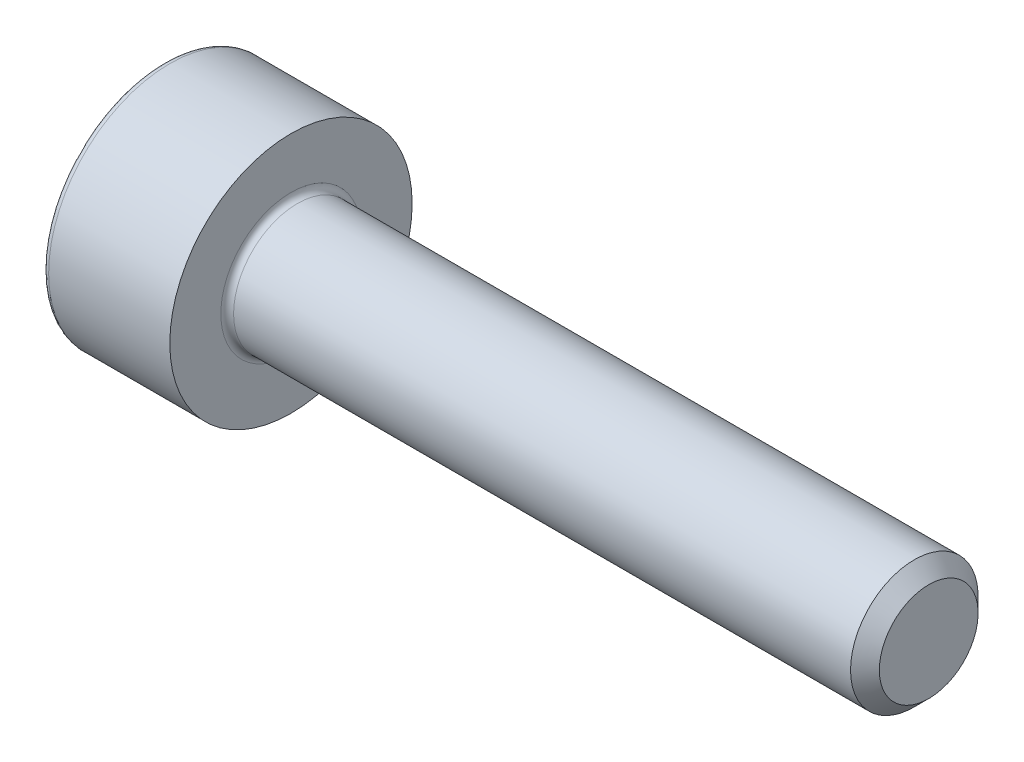
ISO-10303-21;
HEADER;
FILE_DESCRIPTION(('STEP AP214'),'2;1');
FILE_NAME('part.step','',(''),(''),'','','');
FILE_SCHEMA(('AUTOMOTIVE_DESIGN { 1 0 10303 214 1 1 1 1 }'));
ENDSEC;
DATA;
#1=APPLICATION_CONTEXT('core data for automotive mechanical design processes');
#2=APPLICATION_PROTOCOL_DEFINITION('international standard','automotive_design',2000,#1);
#3=PRODUCT_CONTEXT('',#1,'mechanical');
#4=PRODUCT('Part','Part','',(#3));
#5=PRODUCT_RELATED_PRODUCT_CATEGORY('part','',(#4));
#6=PRODUCT_DEFINITION_FORMATION('','',#4);
#7=PRODUCT_DEFINITION_CONTEXT('part definition',#1,'design');
#8=PRODUCT_DEFINITION('design','',#6,#7);
#9=PRODUCT_DEFINITION_SHAPE('','',#8);
#10=(LENGTH_UNIT() NAMED_UNIT(*) SI_UNIT(.MILLI.,.METRE.));
#11=(NAMED_UNIT(*) PLANE_ANGLE_UNIT() SI_UNIT($,.RADIAN.));
#12=(NAMED_UNIT(*) SI_UNIT($,.STERADIAN.) SOLID_ANGLE_UNIT());
#13=UNCERTAINTY_MEASURE_WITH_UNIT(LENGTH_MEASURE(1.E-05),#10,'distance_accuracy_value','');
#14=(GEOMETRIC_REPRESENTATION_CONTEXT(3) GLOBAL_UNCERTAINTY_ASSIGNED_CONTEXT((#13)) GLOBAL_UNIT_ASSIGNED_CONTEXT((#10,
#11,#12)) REPRESENTATION_CONTEXT('',''));
#15=CARTESIAN_POINT('',(0.,0.,0.));
#16=DIRECTION('',(0.,0.,1.));
#17=DIRECTION('',(1.,0.,0.));
#18=AXIS2_PLACEMENT_3D('',#15,#16,#17);
#19=CARTESIAN_POINT('',(0.,0.,0.));
#20=DIRECTION('',(-1.,0.,0.));
#21=DIRECTION('',(0.,0.,1.));
#22=AXIS2_PLACEMENT_3D('',#19,#20,#21);
#23=PLANE('',#22);
#24=DIRECTION('',(0.,-0.5,0.86602540378444));
#25=VECTOR('',#24,1.);
#26=CARTESIAN_POINT('',(0.,0.892006165897967,0.));
#27=LINE('',#26,#25);
#28=CARTESIAN_POINT('',(0.,0.892006165897967,0.));
#29=VERTEX_POINT('',#28);
#30=CARTESIAN_POINT('',(0.,0.446003082948983,0.7725));
#31=VERTEX_POINT('',#30);
#32=EDGE_CURVE('E246',#29,#31,#27,.T.);
#33=ORIENTED_EDGE('',*,*,#32,.T.);
#34=DIRECTION('',(0.,1.,0.));
#35=VECTOR('',#34,1.);
#36=CARTESIAN_POINT('',(0.,-0.446003082948988,0.7725));
#37=LINE('',#36,#35);
#38=CARTESIAN_POINT('',(0.,-0.446003082948988,0.7725));
#39=VERTEX_POINT('',#38);
#40=EDGE_CURVE('E113',#39,#31,#37,.T.);
#41=ORIENTED_EDGE('',*,*,#40,.F.);
#42=DIRECTION('',(0.,-0.5,-0.866025403784438));
#43=VECTOR('',#42,1.);
#44=CARTESIAN_POINT('',(0.,-0.446003082948988,0.7725));
#45=LINE('',#44,#43);
#46=CARTESIAN_POINT('',(0.,-0.892006165897974,0.));
#47=VERTEX_POINT('',#46);
#48=EDGE_CURVE('E249',#39,#47,#45,.T.);
#49=ORIENTED_EDGE('',*,*,#48,.T.);
#50=DIRECTION('',(0.,0.5,-0.86602540378444));
#51=VECTOR('',#50,1.);
#52=CARTESIAN_POINT('',(0.,-0.892006165897974,0.));
#53=LINE('',#52,#51);
#54=CARTESIAN_POINT('',(0.,-0.446003082948991,-0.7725));
#55=VERTEX_POINT('',#54);
#56=EDGE_CURVE('E252',#47,#55,#53,.T.);
#57=ORIENTED_EDGE('',*,*,#56,.T.);
#58=DIRECTION('',(0.,-1.,0.));
#59=VECTOR('',#58,1.);
#60=CARTESIAN_POINT('',(0.,0.44600308294898,-0.7725));
#61=LINE('',#60,#59);
#62=CARTESIAN_POINT('',(0.,0.44600308294898,-0.7725));
#63=VERTEX_POINT('',#62);
#64=EDGE_CURVE('E255',#63,#55,#61,.T.);
#65=ORIENTED_EDGE('',*,*,#64,.F.);
#66=DIRECTION('',(0.,-0.5,-0.866025403784438));
#67=VECTOR('',#66,1.);
#68=CARTESIAN_POINT('',(0.,0.892006165897967,0.));
#69=LINE('',#68,#67);
#70=EDGE_CURVE('E108',#29,#63,#69,.T.);
#71=ORIENTED_EDGE('',*,*,#70,.F.);
#72=EDGE_LOOP('',(#33,#41,#49,#57,#65,#71));
#73=FACE_BOUND('',#72,.T.);
#74=CARTESIAN_POINT('',(0.,0.,0.));
#75=DIRECTION('',(-1.,0.,0.));
#76=DIRECTION('',(0.,0.,1.));
#77=AXIS2_PLACEMENT_3D('',#74,#75,#76);
#78=CIRCLE('',#77,1.8);
#79=CARTESIAN_POINT('',(0.,0.,1.8));
#80=VERTEX_POINT('',#79);
#81=EDGE_CURVE('E25',#80,#80,#78,.T.);
#82=ORIENTED_EDGE('',*,*,#81,.T.);
#83=EDGE_LOOP('',(#82));
#84=FACE_BOUND('',#83,.T.);
#85=ADVANCED_FACE('F17',(#73,#84),#23,.T.);
#86=CARTESIAN_POINT('',(-31.75,0.,0.));
#87=DIRECTION('',(-1.,0.,0.));
#88=DIRECTION('',(0.,0.,1.));
#89=AXIS2_PLACEMENT_3D('',#86,#87,#88);
#90=CYLINDRICAL_SURFACE('',#89,1.9);
#91=CARTESIAN_POINT('',(0.100000000000003,0.,0.));
#92=DIRECTION('',(-1.,0.,0.));
#93=DIRECTION('',(0.,0.,1.));
#94=AXIS2_PLACEMENT_3D('',#91,#92,#93);
#95=CIRCLE('',#94,1.9);
#96=CARTESIAN_POINT('',(0.100000000000003,0.,1.9));
#97=VERTEX_POINT('',#96);
#98=EDGE_CURVE('E11',#97,#97,#95,.F.);
#99=ORIENTED_EDGE('',*,*,#98,.T.);
#100=EDGE_LOOP('',(#99));
#101=FACE_BOUND('',#100,.T.);
#102=CARTESIAN_POINT('',(2.,0.,0.));
#103=DIRECTION('',(-1.,0.,0.));
#104=DIRECTION('',(0.,0.,1.));
#105=AXIS2_PLACEMENT_3D('',#102,#103,#104);
#106=CIRCLE('',#105,1.9);
#107=CARTESIAN_POINT('',(2.,0.,1.9));
#108=VERTEX_POINT('',#107);
#109=EDGE_CURVE('E131',#108,#108,#106,.T.);
#110=ORIENTED_EDGE('',*,*,#109,.T.);
#111=EDGE_LOOP('',(#110));
#112=FACE_BOUND('',#111,.T.);
#113=ADVANCED_FACE('F157',(#101,#112),#90,.T.);
#114=CARTESIAN_POINT('',(2.,1.9,0.));
#115=DIRECTION('',(1.,0.,0.));
#116=DIRECTION('',(0.,0.,-1.));
#117=AXIS2_PLACEMENT_3D('',#114,#115,#116);
#118=PLANE('',#117);
#119=CARTESIAN_POINT('',(2.,0.,0.));
#120=DIRECTION('',(1.,0.,0.));
#121=DIRECTION('',(0.,0.,-1.));
#122=AXIS2_PLACEMENT_3D('',#119,#120,#121);
#123=CIRCLE('',#122,1.1);
#124=CARTESIAN_POINT('',(2.,0.,-1.1));
#125=VERTEX_POINT('',#124);
#126=EDGE_CURVE('E134',#125,#125,#123,.F.);
#127=ORIENTED_EDGE('',*,*,#126,.T.);
#128=EDGE_LOOP('',(#127));
#129=FACE_BOUND('',#128,.T.);
#130=ORIENTED_EDGE('',*,*,#109,.F.);
#131=EDGE_LOOP('',(#130));
#132=FACE_BOUND('',#131,.T.);
#133=ADVANCED_FACE('F164',(#129,#132),#118,.T.);
#134=CARTESIAN_POINT('',(-31.75,0.,0.));
#135=DIRECTION('',(-1.,0.,0.));
#136=DIRECTION('',(0.,0.,1.));
#137=AXIS2_PLACEMENT_3D('',#134,#135,#136);
#138=CYLINDRICAL_SURFACE('',#137,1.);
#139=CARTESIAN_POINT('',(2.1,0.,0.));
#140=DIRECTION('',(1.,0.,0.));
#141=DIRECTION('',(0.,0.,-1.));
#142=AXIS2_PLACEMENT_3D('',#139,#140,#141);
#143=CIRCLE('',#142,1.);
#144=CARTESIAN_POINT('',(2.1,0.,-1.));
#145=VERTEX_POINT('',#144);
#146=EDGE_CURVE('E137',#145,#145,#143,.T.);
#147=ORIENTED_EDGE('',*,*,#146,.T.);
#148=EDGE_LOOP('',(#147));
#149=FACE_BOUND('',#148,.T.);
#150=CARTESIAN_POINT('',(11.774,0.,0.));
#151=DIRECTION('',(-1.,0.,0.));
#152=DIRECTION('',(0.,0.,1.));
#153=AXIS2_PLACEMENT_3D('',#150,#151,#152);
#154=CIRCLE('',#153,0.999999999999987);
#155=CARTESIAN_POINT('',(11.774,0.,0.999999999999987));
#156=VERTEX_POINT('',#155);
#157=EDGE_CURVE('E128',#156,#156,#154,.T.);
#158=ORIENTED_EDGE('',*,*,#157,.T.);
#159=EDGE_LOOP('',(#158));
#160=FACE_BOUND('',#159,.T.);
#161=ADVANCED_FACE('F170',(#149,#160),#138,.T.);
#162=CARTESIAN_POINT('',(12.,0.,0.));
#163=DIRECTION('',(-1.,0.,0.));
#164=DIRECTION('',(0.,0.,1.));
#165=AXIS2_PLACEMENT_3D('',#162,#163,#164);
#166=CONICAL_SURFACE('',#165,0.774,0.785398163397411);
#167=ORIENTED_EDGE('',*,*,#157,.F.);
#168=EDGE_LOOP('',(#167));
#169=FACE_BOUND('',#168,.T.);
#170=CARTESIAN_POINT('',(12.,0.,0.));
#171=DIRECTION('',(-1.,0.,0.));
#172=DIRECTION('',(0.,0.,1.));
#173=AXIS2_PLACEMENT_3D('',#170,#171,#172);
#174=CIRCLE('',#173,0.774);
#175=CARTESIAN_POINT('',(12.,0.,0.774));
#176=VERTEX_POINT('',#175);
#177=EDGE_CURVE('E124',#176,#176,#174,.T.);
#178=ORIENTED_EDGE('',*,*,#177,.T.);
#179=EDGE_LOOP('',(#178));
#180=FACE_BOUND('',#179,.T.);
#181=ADVANCED_FACE('F174',(#169,#180),#166,.T.);
#182=CARTESIAN_POINT('',(12.,0.774,0.));
#183=DIRECTION('',(1.,0.,0.));
#184=DIRECTION('',(0.,0.,-1.));
#185=AXIS2_PLACEMENT_3D('',#182,#183,#184);
#186=PLANE('',#185);
#187=ORIENTED_EDGE('',*,*,#177,.F.);
#188=EDGE_LOOP('',(#187));
#189=FACE_BOUND('',#188,.T.);
#190=ADVANCED_FACE('F153',(#189),#186,.T.);
#191=CARTESIAN_POINT('',(2.1,0.,0.));
#192=DIRECTION('',(1.,0.,0.));
#193=DIRECTION('',(0.,0.,-1.));
#194=AXIS2_PLACEMENT_3D('',#191,#192,#193);
#195=TOROIDAL_SURFACE('',#194,1.1,0.1);
#196=ORIENTED_EDGE('',*,*,#146,.F.);
#197=EDGE_LOOP('',(#196));
#198=FACE_BOUND('',#197,.T.);
#199=ORIENTED_EDGE('',*,*,#126,.F.);
#200=EDGE_LOOP('',(#199));
#201=FACE_BOUND('',#200,.T.);
#202=ADVANCED_FACE('F144',(#198,#201),#195,.F.);
#203=CARTESIAN_POINT('',(0.100000000000003,0.,0.));
#204=DIRECTION('',(-1.,0.,0.));
#205=DIRECTION('',(0.,0.,1.));
#206=AXIS2_PLACEMENT_3D('',#203,#204,#205);
#207=TOROIDAL_SURFACE('',#206,1.8,0.1);
#208=ORIENTED_EDGE('',*,*,#98,.F.);
#209=EDGE_LOOP('',(#208));
#210=FACE_BOUND('',#209,.T.);
#211=ORIENTED_EDGE('',*,*,#81,.F.);
#212=EDGE_LOOP('',(#211));
#213=FACE_BOUND('',#212,.T.);
#214=ADVANCED_FACE('F19',(#210,#213),#207,.T.);
#215=CARTESIAN_POINT('',(1.,0.892006165897967,0.));
#216=DIRECTION('',(0.,-0.86602540378444,-0.5));
#217=DIRECTION('',(0.,0.5,-0.86602540378444));
#218=AXIS2_PLACEMENT_3D('',#215,#216,#217);
#219=PLANE('',#218);
#220=ORIENTED_EDGE('',*,*,#32,.F.);
#221=DIRECTION('',(-1.,0.,0.));
#222=VECTOR('',#221,1.);
#223=CARTESIAN_POINT('',(1.,0.892006165897967,0.));
#224=LINE('',#223,#222);
#225=CARTESIAN_POINT('',(1.,0.892006165897967,0.));
#226=VERTEX_POINT('',#225);
#227=EDGE_CURVE('E236',#226,#29,#224,.T.);
#228=ORIENTED_EDGE('',*,*,#227,.F.);
#229=DIRECTION('',(0.,-0.5,0.86602540378444));
#230=VECTOR('',#229,1.);
#231=CARTESIAN_POINT('',(1.,0.892006165897967,0.));
#232=LINE('',#231,#230);
#233=CARTESIAN_POINT('',(1.,0.669004624423476,0.38625));
#234=VERTEX_POINT('',#233);
#235=EDGE_CURVE('E100',#226,#234,#232,.T.);
#236=ORIENTED_EDGE('',*,*,#235,.T.);
#237=CARTESIAN_POINT('',(1.,0.446003082948983,0.7725));
#238=VERTEX_POINT('',#237);
#239=EDGE_CURVE('E91',#234,#238,#232,.T.);
#240=ORIENTED_EDGE('',*,*,#239,.T.);
#241=DIRECTION('',(-1.,0.,0.));
#242=VECTOR('',#241,1.);
#243=CARTESIAN_POINT('',(1.,0.446003082948983,0.7725));
#244=LINE('',#243,#242);
#245=EDGE_CURVE('E105',#238,#31,#244,.T.);
#246=ORIENTED_EDGE('',*,*,#245,.T.);
#247=EDGE_LOOP('',(#220,#228,#236,#240,#246));
#248=FACE_BOUND('',#247,.T.);
#249=ADVANCED_FACE('F104',(#248),#219,.T.);
#250=CARTESIAN_POINT('',(1.,-0.446003082948988,0.7725));
#251=DIRECTION('',(0.,0.,1.));
#252=DIRECTION('',(0.,-1.,0.));
#253=AXIS2_PLACEMENT_3D('',#250,#251,#252);
#254=PLANE('',#253);
#255=ORIENTED_EDGE('',*,*,#40,.T.);
#256=ORIENTED_EDGE('',*,*,#245,.F.);
#257=DIRECTION('',(0.,1.,0.));
#258=VECTOR('',#257,1.);
#259=CARTESIAN_POINT('',(1.,-0.446003082948988,0.7725));
#260=LINE('',#259,#258);
#261=CARTESIAN_POINT('',(1.,0.,0.7725));
#262=VERTEX_POINT('',#261);
#263=EDGE_CURVE('E88',#262,#238,#260,.T.);
#264=ORIENTED_EDGE('',*,*,#263,.F.);
#265=CARTESIAN_POINT('',(1.,-0.446003082948988,0.7725));
#266=VERTEX_POINT('',#265);
#267=EDGE_CURVE('E99',#266,#262,#260,.T.);
#268=ORIENTED_EDGE('',*,*,#267,.F.);
#269=DIRECTION('',(-1.,0.,0.));
#270=VECTOR('',#269,1.);
#271=CARTESIAN_POINT('',(1.,-0.446003082948988,0.7725));
#272=LINE('',#271,#270);
#273=EDGE_CURVE('E115',#266,#39,#272,.T.);
#274=ORIENTED_EDGE('',*,*,#273,.T.);
#275=EDGE_LOOP('',(#255,#256,#264,#268,#274));
#276=FACE_BOUND('',#275,.T.);
#277=ADVANCED_FACE('F110',(#276),#254,.F.);
#278=CARTESIAN_POINT('',(1.,-0.446003082948988,0.7725));
#279=DIRECTION('',(0.,0.866025403784438,-0.5));
#280=DIRECTION('',(0.,0.5,0.866025403784438));
#281=AXIS2_PLACEMENT_3D('',#278,#279,#280);
#282=PLANE('',#281);
#283=ORIENTED_EDGE('',*,*,#48,.F.);
#284=ORIENTED_EDGE('',*,*,#273,.F.);
#285=DIRECTION('',(0.,-0.5,-0.866025403784438));
#286=VECTOR('',#285,1.);
#287=CARTESIAN_POINT('',(1.,-0.446003082948988,0.7725));
#288=LINE('',#287,#286);
#289=CARTESIAN_POINT('',(1.,-0.66900462442348,0.38625));
#290=VERTEX_POINT('',#289);
#291=EDGE_CURVE('E275',#266,#290,#288,.T.);
#292=ORIENTED_EDGE('',*,*,#291,.T.);
#293=CARTESIAN_POINT('',(1.,-0.892006165897974,0.));
#294=VERTEX_POINT('',#293);
#295=EDGE_CURVE('E264',#290,#294,#288,.T.);
#296=ORIENTED_EDGE('',*,*,#295,.T.);
#297=DIRECTION('',(-1.,0.,0.));
#298=VECTOR('',#297,1.);
#299=CARTESIAN_POINT('',(1.,-0.892006165897974,0.));
#300=LINE('',#299,#298);
#301=EDGE_CURVE('E120',#294,#47,#300,.T.);
#302=ORIENTED_EDGE('',*,*,#301,.T.);
#303=EDGE_LOOP('',(#283,#284,#292,#296,#302));
#304=FACE_BOUND('',#303,.T.);
#305=ADVANCED_FACE('F188',(#304),#282,.T.);
#306=CARTESIAN_POINT('',(1.,-0.892006165897974,0.));
#307=DIRECTION('',(0.,0.86602540378444,0.5));
#308=DIRECTION('',(0.,-0.5,0.86602540378444));
#309=AXIS2_PLACEMENT_3D('',#306,#307,#308);
#310=PLANE('',#309);
#311=ORIENTED_EDGE('',*,*,#56,.F.);
#312=ORIENTED_EDGE('',*,*,#301,.F.);
#313=DIRECTION('',(0.,0.5,-0.86602540378444));
#314=VECTOR('',#313,1.);
#315=CARTESIAN_POINT('',(1.,-0.892006165897974,0.));
#316=LINE('',#315,#314);
#317=CARTESIAN_POINT('',(1.,-0.669004624423483,-0.38625));
#318=VERTEX_POINT('',#317);
#319=EDGE_CURVE('E242',#294,#318,#316,.T.);
#320=ORIENTED_EDGE('',*,*,#319,.T.);
#321=CARTESIAN_POINT('',(1.,-0.446003082948991,-0.7725));
#322=VERTEX_POINT('',#321);
#323=EDGE_CURVE('E274',#318,#322,#316,.T.);
#324=ORIENTED_EDGE('',*,*,#323,.T.);
#325=DIRECTION('',(-1.,0.,0.));
#326=VECTOR('',#325,1.);
#327=CARTESIAN_POINT('',(1.,-0.446003082948991,-0.7725));
#328=LINE('',#327,#326);
#329=EDGE_CURVE('E235',#322,#55,#328,.T.);
#330=ORIENTED_EDGE('',*,*,#329,.T.);
#331=EDGE_LOOP('',(#311,#312,#320,#324,#330));
#332=FACE_BOUND('',#331,.T.);
#333=ADVANCED_FACE('F191',(#332),#310,.T.);
#334=CARTESIAN_POINT('',(1.,0.44600308294898,-0.7725));
#335=DIRECTION('',(0.,0.,-1.));
#336=DIRECTION('',(0.,1.,0.));
#337=AXIS2_PLACEMENT_3D('',#334,#335,#336);
#338=PLANE('',#337);
#339=ORIENTED_EDGE('',*,*,#64,.T.);
#340=ORIENTED_EDGE('',*,*,#329,.F.);
#341=DIRECTION('',(0.,-1.,0.));
#342=VECTOR('',#341,1.);
#343=CARTESIAN_POINT('',(1.,0.44600308294898,-0.7725));
#344=LINE('',#343,#342);
#345=CARTESIAN_POINT('',(1.,0.,-0.7725));
#346=VERTEX_POINT('',#345);
#347=EDGE_CURVE('E239',#346,#322,#344,.T.);
#348=ORIENTED_EDGE('',*,*,#347,.F.);
#349=CARTESIAN_POINT('',(1.,0.44600308294898,-0.7725));
#350=VERTEX_POINT('',#349);
#351=EDGE_CURVE('E32',#350,#346,#344,.T.);
#352=ORIENTED_EDGE('',*,*,#351,.F.);
#353=DIRECTION('',(-1.,0.,0.));
#354=VECTOR('',#353,1.);
#355=CARTESIAN_POINT('',(1.,0.44600308294898,-0.7725));
#356=LINE('',#355,#354);
#357=EDGE_CURVE('E232',#350,#63,#356,.T.);
#358=ORIENTED_EDGE('',*,*,#357,.T.);
#359=EDGE_LOOP('',(#339,#340,#348,#352,#358));
#360=FACE_BOUND('',#359,.T.);
#361=ADVANCED_FACE('F195',(#360),#338,.F.);
#362=CARTESIAN_POINT('',(1.,0.892006165897967,0.));
#363=DIRECTION('',(0.,0.866025403784438,-0.5));
#364=DIRECTION('',(0.,0.5,0.866025403784438));
#365=AXIS2_PLACEMENT_3D('',#362,#363,#364);
#366=PLANE('',#365);
#367=ORIENTED_EDGE('',*,*,#70,.T.);
#368=ORIENTED_EDGE('',*,*,#357,.F.);
#369=DIRECTION('',(0.,-0.5,-0.866025403784438));
#370=VECTOR('',#369,1.);
#371=CARTESIAN_POINT('',(1.,0.892006165897967,0.));
#372=LINE('',#371,#370);
#373=CARTESIAN_POINT('',(1.,0.669004624423475,-0.38625));
#374=VERTEX_POINT('',#373);
#375=EDGE_CURVE('E222',#374,#350,#372,.T.);
#376=ORIENTED_EDGE('',*,*,#375,.F.);
#377=EDGE_CURVE('E228',#226,#374,#372,.T.);
#378=ORIENTED_EDGE('',*,*,#377,.F.);
#379=ORIENTED_EDGE('',*,*,#227,.T.);
#380=EDGE_LOOP('',(#367,#368,#376,#378,#379));
#381=FACE_BOUND('',#380,.T.);
#382=ADVANCED_FACE('F199',(#381),#366,.F.);
#383=CARTESIAN_POINT('',(1.,1.33800924884695,-0.7725));
#384=DIRECTION('',(1.,0.,0.));
#385=DIRECTION('',(0.,0.,-1.));
#386=AXIS2_PLACEMENT_3D('',#383,#384,#385);
#387=PLANE('',#386);
#388=ORIENTED_EDGE('',*,*,#347,.T.);
#389=ORIENTED_EDGE('',*,*,#323,.F.);
#390=CARTESIAN_POINT('',(1.,0.,0.));
#391=DIRECTION('',(-1.,0.,0.));
#392=DIRECTION('',(0.,0.,1.));
#393=AXIS2_PLACEMENT_3D('',#390,#391,#392);
#394=CIRCLE('',#393,0.7725);
#395=EDGE_CURVE('E270',#346,#318,#394,.T.);
#396=ORIENTED_EDGE('',*,*,#395,.F.);
#397=EDGE_LOOP('',(#388,#389,#396));
#398=FACE_BOUND('',#397,.T.);
#399=ADVANCED_FACE('F203',(#398),#387,.F.);
#400=ORIENTED_EDGE('',*,*,#319,.F.);
#401=ORIENTED_EDGE('',*,*,#295,.F.);
#402=EDGE_CURVE('E118',#318,#290,#394,.T.);
#403=ORIENTED_EDGE('',*,*,#402,.F.);
#404=EDGE_LOOP('',(#400,#401,#403));
#405=FACE_BOUND('',#404,.T.);
#406=ADVANCED_FACE('F206',(#405),#387,.F.);
#407=ORIENTED_EDGE('',*,*,#291,.F.);
#408=ORIENTED_EDGE('',*,*,#267,.T.);
#409=EDGE_CURVE('E114',#290,#262,#394,.T.);
#410=ORIENTED_EDGE('',*,*,#409,.F.);
#411=EDGE_LOOP('',(#407,#408,#410));
#412=FACE_BOUND('',#411,.T.);
#413=ADVANCED_FACE('F212',(#412),#387,.F.);
#414=ORIENTED_EDGE('',*,*,#263,.T.);
#415=ORIENTED_EDGE('',*,*,#239,.F.);
#416=EDGE_CURVE('E94',#262,#234,#394,.T.);
#417=ORIENTED_EDGE('',*,*,#416,.F.);
#418=EDGE_LOOP('',(#414,#415,#417));
#419=FACE_BOUND('',#418,.T.);
#420=ADVANCED_FACE('F90',(#419),#387,.F.);
#421=ORIENTED_EDGE('',*,*,#235,.F.);
#422=ORIENTED_EDGE('',*,*,#377,.T.);
#423=EDGE_CURVE('E125',#234,#374,#394,.T.);
#424=ORIENTED_EDGE('',*,*,#423,.F.);
#425=EDGE_LOOP('',(#421,#422,#424));
#426=FACE_BOUND('',#425,.T.);
#427=ADVANCED_FACE('F215',(#426),#387,.F.);
#428=ORIENTED_EDGE('',*,*,#375,.T.);
#429=ORIENTED_EDGE('',*,*,#351,.T.);
#430=EDGE_CURVE('E225',#374,#346,#394,.T.);
#431=ORIENTED_EDGE('',*,*,#430,.F.);
#432=EDGE_LOOP('',(#428,#429,#431));
#433=FACE_BOUND('',#432,.T.);
#434=ADVANCED_FACE('F184',(#433),#387,.F.);
#435=CARTESIAN_POINT('',(1.,0.,0.));
#436=DIRECTION('',(-1.,0.,0.));
#437=DIRECTION('',(0.,0.,1.));
#438=AXIS2_PLACEMENT_3D('',#435,#436,#437);
#439=CONICAL_SURFACE('',#438,0.7725,1.04719755119659);
#440=CARTESIAN_POINT('',(1.446003082949,0.,0.));
#441=VERTEX_POINT('',#440);
#442=VERTEX_LOOP('',#441);
#443=FACE_BOUND('',#442,.T.);
#444=ORIENTED_EDGE('',*,*,#416,.T.);
#445=ORIENTED_EDGE('',*,*,#423,.T.);
#446=ORIENTED_EDGE('',*,*,#430,.T.);
#447=ORIENTED_EDGE('',*,*,#395,.T.);
#448=ORIENTED_EDGE('',*,*,#402,.T.);
#449=ORIENTED_EDGE('',*,*,#409,.T.);
#450=EDGE_LOOP('',(#444,#445,#446,#447,#448,#449));
#451=FACE_BOUND('',#450,.T.);
#452=ADVANCED_FACE('F182',(#443,#451),#439,.F.);
#453=CLOSED_SHELL('',(#85,#113,#133,#161,#181,#190,#202,#214,#249,#277,#305,#333,#361,#382,#399,
#406,#413,#420,#427,#434,#452));
#454=MANIFOLD_SOLID_BREP('B1',#453);
#455=ADVANCED_BREP_SHAPE_REPRESENTATION('',(#18,#454),#14);
#456=SHAPE_DEFINITION_REPRESENTATION(#9,#455);
ENDSEC;
END-ISO-10303-21;
